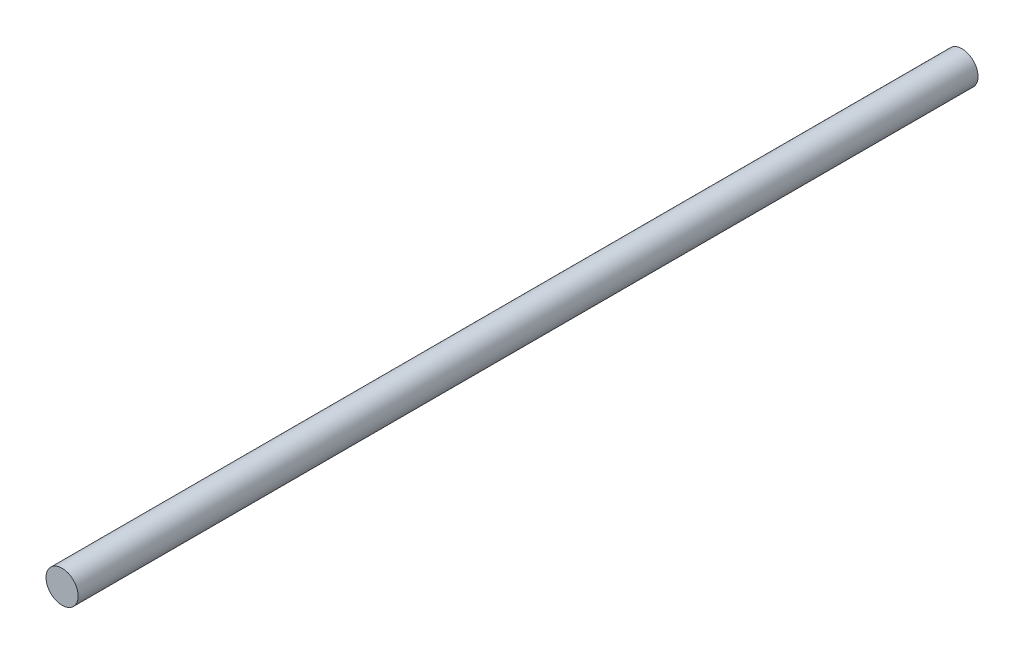
ISO-10303-21;
HEADER;
FILE_DESCRIPTION(('STEP AP214'),'2;1');
FILE_NAME('part.step','',(''),(''),'','','');
FILE_SCHEMA(('AUTOMOTIVE_DESIGN { 1 0 10303 214 1 1 1 1 }'));
ENDSEC;
DATA;
#1=APPLICATION_CONTEXT('core data for automotive mechanical design processes');
#2=APPLICATION_PROTOCOL_DEFINITION('international standard','automotive_design',2000,#1);
#3=PRODUCT_CONTEXT('',#1,'mechanical');
#4=PRODUCT('Part','Part','',(#3));
#5=PRODUCT_RELATED_PRODUCT_CATEGORY('part','',(#4));
#6=PRODUCT_DEFINITION_FORMATION('','',#4);
#7=PRODUCT_DEFINITION_CONTEXT('part definition',#1,'design');
#8=PRODUCT_DEFINITION('design','',#6,#7);
#9=PRODUCT_DEFINITION_SHAPE('','',#8);
#10=(LENGTH_UNIT() NAMED_UNIT(*) SI_UNIT(.MILLI.,.METRE.));
#11=(NAMED_UNIT(*) PLANE_ANGLE_UNIT() SI_UNIT($,.RADIAN.));
#12=(NAMED_UNIT(*) SI_UNIT($,.STERADIAN.) SOLID_ANGLE_UNIT());
#13=UNCERTAINTY_MEASURE_WITH_UNIT(LENGTH_MEASURE(1.E-05),#10,'distance_accuracy_value','');
#14=(GEOMETRIC_REPRESENTATION_CONTEXT(3) GLOBAL_UNCERTAINTY_ASSIGNED_CONTEXT((#13)) GLOBAL_UNIT_ASSIGNED_CONTEXT((#10,
#11,#12)) REPRESENTATION_CONTEXT('',''));
#15=CARTESIAN_POINT('',(0.,0.,0.));
#16=DIRECTION('',(0.,0.,1.));
#17=DIRECTION('',(1.,0.,0.));
#18=AXIS2_PLACEMENT_3D('',#15,#16,#17);
#19=CARTESIAN_POINT('',(-1.66533453693773E-13,-4.44089209850063E-13,279.999999999997));
#20=DIRECTION('',(0.,0.,-0.999999999999996));
#21=DIRECTION('',(-0.999999999999996,0.,0.));
#22=AXIS2_PLACEMENT_3D('',#19,#20,#21);
#23=CYLINDRICAL_SURFACE('',#22,5.);
#24=CARTESIAN_POINT('',(-1.66533453693773E-13,-4.44089209850063E-13,279.999999999997));
#25=DIRECTION('',(0.,0.,0.999999999999996));
#26=DIRECTION('',(0.999999999999996,0.,0.));
#27=AXIS2_PLACEMENT_3D('',#24,#25,#26);
#28=CIRCLE('',#27,5.);
#29=CARTESIAN_POINT('',(-5.00000000000015,-4.50195436485501E-13,279.999999999997));
#30=VERTEX_POINT('',#29);
#31=EDGE_CURVE('E10',#30,#30,#28,.T.);
#32=CARTESIAN_POINT('',(0.,0.,0.));
#33=DIRECTION('',(0.,0.,0.999999999999996));
#34=DIRECTION('',(0.999999999999996,0.,0.));
#35=AXIS2_PLACEMENT_3D('',#32,#33,#34);
#36=CIRCLE('',#35,5.);
#37=CARTESIAN_POINT('',(-5.00000000000015,-4.50195436485501E-13,0.));
#38=VERTEX_POINT('',#37);
#39=EDGE_CURVE('E36',#38,#38,#36,.T.);
#40=CARTESIAN_POINT('',(-5.00000000000015,-4.50195436485501E-13,279.999999999997));
#41=CARTESIAN_POINT('',(-5.00000000000015,-4.50195436485501E-13,277.083333333331));
#42=CARTESIAN_POINT('',(-5.00000000000015,-4.50195436485501E-13,274.166666666664));
#43=CARTESIAN_POINT('',(-5.00000000000015,-4.50195436485501E-13,268.333333333331));
#44=CARTESIAN_POINT('',(-5.00000000000015,-4.50195436485501E-13,265.416666666664));
#45=CARTESIAN_POINT('',(-5.00000000000015,-4.50195436485501E-13,259.583333333331));
#46=CARTESIAN_POINT('',(-5.00000000000015,-4.50195436485501E-13,256.666666666664));
#47=CARTESIAN_POINT('',(-5.00000000000015,-4.50195436485501E-13,250.833333333331));
#48=CARTESIAN_POINT('',(-5.00000000000015,-4.50195436485501E-13,247.916666666664));
#49=CARTESIAN_POINT('',(-5.00000000000015,-4.50195436485501E-13,242.083333333331));
#50=CARTESIAN_POINT('',(-5.00000000000015,-4.50195436485501E-13,239.166666666664));
#51=CARTESIAN_POINT('',(-5.00000000000015,-4.50195436485501E-13,233.333333333331));
#52=CARTESIAN_POINT('',(-5.00000000000015,-4.50195436485501E-13,230.416666666664));
#53=CARTESIAN_POINT('',(-5.00000000000015,-4.50195436485501E-13,224.583333333331));
#54=CARTESIAN_POINT('',(-5.00000000000015,-4.50195436485501E-13,221.666666666665));
#55=CARTESIAN_POINT('',(-5.00000000000015,-4.50195436485501E-13,215.833333333331));
#56=CARTESIAN_POINT('',(-5.00000000000015,-4.50195436485501E-13,212.916666666665));
#57=CARTESIAN_POINT('',(-5.00000000000015,-4.50195436485501E-13,207.083333333331));
#58=CARTESIAN_POINT('',(-5.00000000000015,-4.50195436485501E-13,204.166666666665));
#59=CARTESIAN_POINT('',(-5.00000000000015,-4.50195436485501E-13,198.333333333331));
#60=CARTESIAN_POINT('',(-5.00000000000015,-4.50195436485501E-13,195.416666666665));
#61=CARTESIAN_POINT('',(-5.00000000000015,-4.50195436485501E-13,189.583333333332));
#62=CARTESIAN_POINT('',(-5.00000000000015,-4.50195436485501E-13,186.666666666665));
#63=CARTESIAN_POINT('',(-5.00000000000015,-4.50195436485501E-13,180.833333333332));
#64=CARTESIAN_POINT('',(-5.00000000000015,-4.50195436485501E-13,177.916666666665));
#65=CARTESIAN_POINT('',(-5.00000000000015,-4.50195436485501E-13,172.083333333332));
#66=CARTESIAN_POINT('',(-5.00000000000015,-4.50195436485501E-13,169.166666666665));
#67=CARTESIAN_POINT('',(-5.00000000000015,-4.50195436485501E-13,163.333333333332));
#68=CARTESIAN_POINT('',(-5.00000000000015,-4.50195436485501E-13,160.416666666665));
#69=CARTESIAN_POINT('',(-5.00000000000015,-4.50195436485501E-13,154.583333333332));
#70=CARTESIAN_POINT('',(-5.00000000000015,-4.50195436485501E-13,151.666666666665));
#71=CARTESIAN_POINT('',(-5.00000000000015,-4.50195436485501E-13,145.833333333332));
#72=CARTESIAN_POINT('',(-5.00000000000015,-4.50195436485501E-13,142.916666666665));
#73=CARTESIAN_POINT('',(-5.00000000000015,-4.50195436485501E-13,137.083333333332));
#74=CARTESIAN_POINT('',(-5.00000000000015,-4.50195436485501E-13,134.166666666665));
#75=CARTESIAN_POINT('',(-5.00000000000015,-4.50195436485501E-13,128.333333333332));
#76=CARTESIAN_POINT('',(-5.00000000000015,-4.50195436485501E-13,125.416666666666));
#77=CARTESIAN_POINT('',(-5.00000000000015,-4.50195436485501E-13,119.583333333332));
#78=CARTESIAN_POINT('',(-5.00000000000015,-4.50195436485501E-13,116.666666666666));
#79=CARTESIAN_POINT('',(-5.00000000000015,-4.50195436485501E-13,110.833333333332));
#80=CARTESIAN_POINT('',(-5.00000000000015,-4.50195436485501E-13,107.916666666666));
#81=CARTESIAN_POINT('',(-5.00000000000015,-4.50195436485501E-13,102.083333333332));
#82=CARTESIAN_POINT('',(-5.00000000000015,-4.50195436485501E-13,99.1666666666658));
#83=CARTESIAN_POINT('',(-5.00000000000015,-4.50195436485501E-13,93.3333333333325));
#84=CARTESIAN_POINT('',(-5.00000000000015,-4.50195436485501E-13,90.4166666666658));
#85=CARTESIAN_POINT('',(-5.00000000000015,-4.50195436485501E-13,84.5833333333326));
#86=CARTESIAN_POINT('',(-5.00000000000015,-4.50195436485501E-13,81.666666666666));
#87=CARTESIAN_POINT('',(-5.00000000000015,-4.50195436485501E-13,75.8333333333327));
#88=CARTESIAN_POINT('',(-5.00000000000015,-4.50195436485501E-13,72.916666666666));
#89=CARTESIAN_POINT('',(-5.00000000000015,-4.50195436485501E-13,67.0833333333328));
#90=CARTESIAN_POINT('',(-5.00000000000015,-4.50195436485501E-13,64.1666666666661));
#91=CARTESIAN_POINT('',(-5.00000000000015,-4.50195436485501E-13,58.3333333333328));
#92=CARTESIAN_POINT('',(-5.00000000000015,-4.50195436485501E-13,55.4166666666662));
#93=CARTESIAN_POINT('',(-5.00000000000015,-4.50195436485501E-13,49.5833333333329));
#94=CARTESIAN_POINT('',(-5.00000000000015,-4.50195436485501E-13,46.6666666666663));
#95=CARTESIAN_POINT('',(-5.00000000000015,-4.50195436485501E-13,40.833333333333));
#96=CARTESIAN_POINT('',(-5.00000000000015,-4.50195436485501E-13,37.9166666666664));
#97=CARTESIAN_POINT('',(-5.00000000000015,-4.50195436485501E-13,32.0833333333331));
#98=CARTESIAN_POINT('',(-5.00000000000015,-4.50195436485501E-13,29.1666666666664));
#99=CARTESIAN_POINT('',(-5.00000000000015,-4.50195436485501E-13,23.3333333333332));
#100=CARTESIAN_POINT('',(-5.00000000000015,-4.50195436485501E-13,20.4166666666665));
#101=CARTESIAN_POINT('',(-5.00000000000015,-4.50195436485501E-13,14.5833333333333));
#102=CARTESIAN_POINT('',(-5.00000000000015,-4.50195436485501E-13,11.6666666666666));
#103=CARTESIAN_POINT('',(-5.00000000000015,-4.50195436485501E-13,5.83333333333334));
#104=CARTESIAN_POINT('',(-5.00000000000015,-4.50195436485501E-13,2.9166666666667));
#105=CARTESIAN_POINT('',(-5.00000000000015,-4.50195436485501E-13,0.));
#106=B_SPLINE_CURVE_WITH_KNOTS('',3,(#40,#41,#42,#43,#44,#45,#46,#47,#48,#49,#50,#51,#52,#53,
#54,#55,#56,#57,#58,#59,#60,#61,#62,#63,#64,#65,#66,#67,#68,#69,#70,#71,#72,#73,#74,#75,#76,#77,
#78,#79,#80,#81,#82,#83,#84,#85,#86,#87,#88,#89,#90,#91,#92,#93,#94,#95,#96,#97,#98,#99,#100,
#101,#102,#103,#104,#105),.UNSPECIFIED.,.F.,.F.,(4,2,2,2,2,2,2,2,2,2,2,2,2,2,2,2,2,2,2,2,2,2,2,
2,2,2,2,2,2,2,2,2,4),(0.,8.74999999999987,17.4999999999998,26.2499999999997,34.9999999999996,
43.7499999999995,52.4999999999994,61.2499999999994,69.9999999999993,78.7499999999992,
87.4999999999991,96.249999999999,104.999999999999,113.749999999999,122.499999999999,
131.249999999999,139.999999999999,148.749999999998,157.499999999998,166.249999999998,
174.999999999998,183.749999999998,192.499999999998,201.249999999998,209.999999999998,
218.749999999998,227.499999999998,236.249999999998,244.999999999997,253.749999999997,
262.499999999997,271.249999999997,279.999999999997),.UNSPECIFIED.);
#107=EDGE_CURVE('BSEAM33',#30,#38,#106,.T.);
#108=ORIENTED_EDGE('',*,*,#31,.F.);
#109=ORIENTED_EDGE('',*,*,#39,.T.);
#110=ORIENTED_EDGE('',*,*,#107,.T.);
#111=ORIENTED_EDGE('',*,*,#107,.F.);
#112=EDGE_LOOP('',(#108,#110,#109,#111));
#113=FACE_BOUND('',#112,.T.);
#114=ADVANCED_FACE('F33',(#113),#23,.T.);
#115=CARTESIAN_POINT('',(-1.66533453693773E-13,-4.44089209850063E-13,279.999999999997));
#116=DIRECTION('',(0.,0.,0.999999999999996));
#117=DIRECTION('',(0.999999999999996,0.,0.));
#118=AXIS2_PLACEMENT_3D('',#115,#116,#117);
#119=PLANE('',#118);
#120=ORIENTED_EDGE('',*,*,#31,.T.);
#121=EDGE_LOOP('',(#120));
#122=FACE_BOUND('',#121,.T.);
#123=ADVANCED_FACE('F48',(#122),#119,.T.);
#124=CARTESIAN_POINT('',(0.,0.,0.));
#125=DIRECTION('',(0.,0.,0.999999999999996));
#126=DIRECTION('',(0.999999999999996,0.,0.));
#127=AXIS2_PLACEMENT_3D('',#124,#125,#126);
#128=PLANE('',#127);
#129=ORIENTED_EDGE('',*,*,#39,.F.);
#130=EDGE_LOOP('',(#129));
#131=FACE_BOUND('',#130,.T.);
#132=ADVANCED_FACE('F46',(#131),#128,.F.);
#133=CLOSED_SHELL('',(#114,#123,#132));
#134=MANIFOLD_SOLID_BREP('B2',#133);
#135=ADVANCED_BREP_SHAPE_REPRESENTATION('',(#18,#134),#14);
#136=SHAPE_DEFINITION_REPRESENTATION(#9,#135);
ENDSEC;
END-ISO-10303-21;
